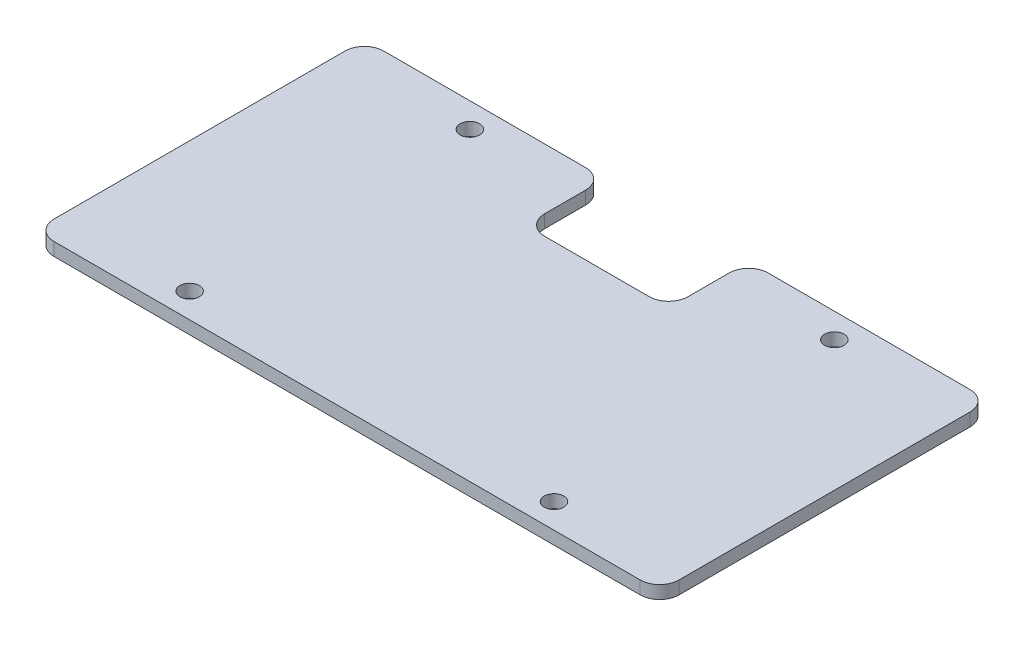
ISO-10303-21;
HEADER;
FILE_DESCRIPTION(('STEP AP214'),'2;1');
FILE_NAME('part.step','',(''),(''),'','','');
FILE_SCHEMA(('AUTOMOTIVE_DESIGN { 1 0 10303 214 1 1 1 1 }'));
ENDSEC;
DATA;
#1=APPLICATION_CONTEXT('core data for automotive mechanical design processes');
#2=APPLICATION_PROTOCOL_DEFINITION('international standard','automotive_design',2000,#1);
#3=PRODUCT_CONTEXT('',#1,'mechanical');
#4=PRODUCT('Part','Part','',(#3));
#5=PRODUCT_RELATED_PRODUCT_CATEGORY('part','',(#4));
#6=PRODUCT_DEFINITION_FORMATION('','',#4);
#7=PRODUCT_DEFINITION_CONTEXT('part definition',#1,'design');
#8=PRODUCT_DEFINITION('design','',#6,#7);
#9=PRODUCT_DEFINITION_SHAPE('','',#8);
#10=(LENGTH_UNIT() NAMED_UNIT(*) SI_UNIT(.MILLI.,.METRE.));
#11=(NAMED_UNIT(*) PLANE_ANGLE_UNIT() SI_UNIT($,.RADIAN.));
#12=(NAMED_UNIT(*) SI_UNIT($,.STERADIAN.) SOLID_ANGLE_UNIT());
#13=UNCERTAINTY_MEASURE_WITH_UNIT(LENGTH_MEASURE(1.E-05),#10,'distance_accuracy_value','');
#14=(GEOMETRIC_REPRESENTATION_CONTEXT(3) GLOBAL_UNCERTAINTY_ASSIGNED_CONTEXT((#13)) GLOBAL_UNIT_ASSIGNED_CONTEXT((#10,
#11,#12)) REPRESENTATION_CONTEXT('',''));
#15=CARTESIAN_POINT('',(0.,0.,0.));
#16=DIRECTION('',(0.,0.,1.));
#17=DIRECTION('',(1.,0.,0.));
#18=AXIS2_PLACEMENT_3D('',#15,#16,#17);
#19=CARTESIAN_POINT('',(0.,2.,0.));
#20=DIRECTION('',(0.,1.,0.));
#21=DIRECTION('',(0.,0.,1.));
#22=AXIS2_PLACEMENT_3D('',#19,#20,#21);
#23=PLANE('',#22);
#24=CARTESIAN_POINT('',(76.193894467691,2.,-46.99));
#25=DIRECTION('',(0.,-1.,0.));
#26=DIRECTION('',(0.,0.,-1.));
#27=AXIS2_PLACEMENT_3D('',#24,#25,#26);
#28=CIRCLE('',#27,1.5);
#29=CARTESIAN_POINT('',(76.193894467691,2.,-48.49));
#30=VERTEX_POINT('',#29);
#31=EDGE_CURVE('E724',#30,#30,#28,.T.);
#32=ORIENTED_EDGE('',*,*,#31,.T.);
#33=EDGE_LOOP('',(#32));
#34=FACE_BOUND('',#33,.T.);
#35=CARTESIAN_POINT('',(20.0638949415345,2.,-46.9827066008931));
#36=DIRECTION('',(0.,1.,0.));
#37=DIRECTION('',(0.,0.,1.));
#38=AXIS2_PLACEMENT_3D('',#35,#36,#37);
#39=CIRCLE('',#38,1.5);
#40=CARTESIAN_POINT('',(20.0638949415345,2.,-45.4827066008931));
#41=VERTEX_POINT('',#40);
#42=EDGE_CURVE('E443',#41,#41,#39,.T.);
#43=ORIENTED_EDGE('',*,*,#42,.F.);
#44=EDGE_LOOP('',(#43));
#45=FACE_BOUND('',#44,.T.);
#46=CARTESIAN_POINT('',(20.0638949415345,2.,-3.81729339910684));
#47=DIRECTION('',(0.,1.,0.));
#48=DIRECTION('',(0.,0.,1.));
#49=AXIS2_PLACEMENT_3D('',#46,#47,#48);
#50=CIRCLE('',#49,1.5);
#51=CARTESIAN_POINT('',(20.0638949415345,2.,-2.31729339910684));
#52=VERTEX_POINT('',#51);
#53=EDGE_CURVE('E431',#52,#52,#50,.F.);
#54=ORIENTED_EDGE('',*,*,#53,.T.);
#55=EDGE_LOOP('',(#54));
#56=FACE_BOUND('',#55,.T.);
#57=DIRECTION('',(0.,0.,1.));
#58=VECTOR('',#57,1.);
#59=CARTESIAN_POINT('',(0.,2.,-50.8));
#60=LINE('',#59,#58);
#61=CARTESIAN_POINT('',(0.,2.,-47.8));
#62=VERTEX_POINT('',#61);
#63=CARTESIAN_POINT('',(0.,2.,-3.));
#64=VERTEX_POINT('',#63);
#65=EDGE_CURVE('E452',#62,#64,#60,.T.);
#66=ORIENTED_EDGE('',*,*,#65,.T.);
#67=CARTESIAN_POINT('',(3.,2.,-3.));
#68=DIRECTION('',(0.,1.,0.));
#69=DIRECTION('',(0.,0.,1.));
#70=AXIS2_PLACEMENT_3D('',#67,#68,#69);
#71=CIRCLE('',#70,3.);
#72=CARTESIAN_POINT('',(3.,2.,0.));
#73=VERTEX_POINT('',#72);
#74=EDGE_CURVE('E360',#64,#73,#71,.T.);
#75=ORIENTED_EDGE('',*,*,#74,.T.);
#76=DIRECTION('',(1.,0.,0.));
#77=VECTOR('',#76,1.);
#78=CARTESIAN_POINT('',(0.,2.,0.));
#79=LINE('',#78,#77);
#80=CARTESIAN_POINT('',(93.27,2.,0.));
#81=VERTEX_POINT('',#80);
#82=EDGE_CURVE('E288',#73,#81,#79,.T.);
#83=ORIENTED_EDGE('',*,*,#82,.T.);
#84=CARTESIAN_POINT('',(93.27,2.,-3.));
#85=DIRECTION('',(0.,1.,0.));
#86=DIRECTION('',(0.,0.,1.));
#87=AXIS2_PLACEMENT_3D('',#84,#85,#86);
#88=CIRCLE('',#87,3.);
#89=CARTESIAN_POINT('',(96.27,2.,-3.));
#90=VERTEX_POINT('',#89);
#91=EDGE_CURVE('E357',#81,#90,#88,.T.);
#92=ORIENTED_EDGE('',*,*,#91,.T.);
#93=DIRECTION('',(0.,0.,-1.));
#94=VECTOR('',#93,1.);
#95=CARTESIAN_POINT('',(96.27,2.,0.));
#96=LINE('',#95,#94);
#97=CARTESIAN_POINT('',(96.27,2.,-47.8));
#98=VERTEX_POINT('',#97);
#99=EDGE_CURVE('E458',#90,#98,#96,.T.);
#100=ORIENTED_EDGE('',*,*,#99,.T.);
#101=CARTESIAN_POINT('',(93.27,2.,-47.8));
#102=DIRECTION('',(0.,1.,0.));
#103=DIRECTION('',(0.,0.,1.));
#104=AXIS2_PLACEMENT_3D('',#101,#102,#103);
#105=CIRCLE('',#104,3.);
#106=CARTESIAN_POINT('',(93.27,2.,-50.8));
#107=VERTEX_POINT('',#106);
#108=EDGE_CURVE('E354',#98,#107,#105,.T.);
#109=ORIENTED_EDGE('',*,*,#108,.T.);
#110=DIRECTION('',(-1.,0.,0.));
#111=VECTOR('',#110,1.);
#112=CARTESIAN_POINT('',(96.27,2.,-50.8));
#113=LINE('',#112,#111);
#114=CARTESIAN_POINT('',(62.18,2.,-50.8));
#115=VERTEX_POINT('',#114);
#116=EDGE_CURVE('E462',#107,#115,#113,.T.);
#117=ORIENTED_EDGE('',*,*,#116,.T.);
#118=CARTESIAN_POINT('',(62.18,2.,-47.8));
#119=DIRECTION('',(0.,1.,0.));
#120=DIRECTION('',(0.,0.,1.));
#121=AXIS2_PLACEMENT_3D('',#118,#119,#120);
#122=CIRCLE('',#121,3.);
#123=CARTESIAN_POINT('',(59.18,2.,-47.8));
#124=VERTEX_POINT('',#123);
#125=EDGE_CURVE('E348',#115,#124,#122,.T.);
#126=ORIENTED_EDGE('',*,*,#125,.T.);
#127=DIRECTION('',(0.,0.,1.));
#128=VECTOR('',#127,1.);
#129=CARTESIAN_POINT('',(59.18,2.,-50.8));
#130=LINE('',#129,#128);
#131=CARTESIAN_POINT('',(59.18,2.,-41.48));
#132=VERTEX_POINT('',#131);
#133=EDGE_CURVE('E426',#124,#132,#130,.T.);
#134=ORIENTED_EDGE('',*,*,#133,.T.);
#135=CARTESIAN_POINT('',(56.18,2.,-41.48));
#136=DIRECTION('',(0.,1.,0.));
#137=DIRECTION('',(0.,0.,1.));
#138=AXIS2_PLACEMENT_3D('',#135,#136,#137);
#139=CIRCLE('',#138,3.);
#140=CARTESIAN_POINT('',(56.18,2.,-38.48));
#141=VERTEX_POINT('',#140);
#142=EDGE_CURVE('E407',#132,#141,#139,.F.);
#143=ORIENTED_EDGE('',*,*,#142,.T.);
#144=DIRECTION('',(-1.,0.,0.));
#145=VECTOR('',#144,1.);
#146=CARTESIAN_POINT('',(59.18,2.,-38.48));
#147=LINE('',#146,#145);
#148=CARTESIAN_POINT('',(40.08,2.,-38.48));
#149=VERTEX_POINT('',#148);
#150=EDGE_CURVE('E423',#141,#149,#147,.T.);
#151=ORIENTED_EDGE('',*,*,#150,.T.);
#152=CARTESIAN_POINT('',(40.08,2.,-41.48));
#153=DIRECTION('',(0.,1.,0.));
#154=DIRECTION('',(0.,0.,1.));
#155=AXIS2_PLACEMENT_3D('',#152,#153,#154);
#156=CIRCLE('',#155,3.);
#157=CARTESIAN_POINT('',(37.08,2.,-41.48));
#158=VERTEX_POINT('',#157);
#159=EDGE_CURVE('E12',#149,#158,#156,.F.);
#160=ORIENTED_EDGE('',*,*,#159,.T.);
#161=DIRECTION('',(0.,0.,-1.));
#162=VECTOR('',#161,1.);
#163=CARTESIAN_POINT('',(37.08,2.,-38.48));
#164=LINE('',#163,#162);
#165=CARTESIAN_POINT('',(37.08,2.,-47.8));
#166=VERTEX_POINT('',#165);
#167=EDGE_CURVE('E325',#158,#166,#164,.T.);
#168=ORIENTED_EDGE('',*,*,#167,.T.);
#169=CARTESIAN_POINT('',(34.08,2.,-47.8));
#170=DIRECTION('',(0.,1.,0.));
#171=DIRECTION('',(0.,0.,1.));
#172=AXIS2_PLACEMENT_3D('',#169,#170,#171);
#173=CIRCLE('',#172,3.);
#174=CARTESIAN_POINT('',(34.08,2.,-50.8));
#175=VERTEX_POINT('',#174);
#176=EDGE_CURVE('E345',#166,#175,#173,.T.);
#177=ORIENTED_EDGE('',*,*,#176,.T.);
#178=DIRECTION('',(-1.,0.,0.));
#179=VECTOR('',#178,1.);
#180=CARTESIAN_POINT('',(37.08,2.,-50.8));
#181=LINE('',#180,#179);
#182=CARTESIAN_POINT('',(3.,2.,-50.8));
#183=VERTEX_POINT('',#182);
#184=EDGE_CURVE('E323',#175,#183,#181,.T.);
#185=ORIENTED_EDGE('',*,*,#184,.T.);
#186=CARTESIAN_POINT('',(3.,2.,-47.8));
#187=DIRECTION('',(0.,1.,0.));
#188=DIRECTION('',(0.,0.,1.));
#189=AXIS2_PLACEMENT_3D('',#186,#187,#188);
#190=CIRCLE('',#189,3.);
#191=EDGE_CURVE('E351',#183,#62,#190,.T.);
#192=ORIENTED_EDGE('',*,*,#191,.T.);
#193=EDGE_LOOP('',(#66,#75,#83,#92,#100,#109,#117,#126,#134,#143,#151,#160,#168,#177,#185,#192));
#194=FACE_BOUND('',#193,.T.);
#195=CARTESIAN_POINT('',(76.193894467691,2.,-3.80999999999998));
#196=DIRECTION('',(0.,1.,0.));
#197=DIRECTION('',(0.,0.,1.));
#198=AXIS2_PLACEMENT_3D('',#195,#196,#197);
#199=CIRCLE('',#198,1.5);
#200=CARTESIAN_POINT('',(76.193894467691,2.,-2.30999999999999));
#201=VERTEX_POINT('',#200);
#202=EDGE_CURVE('E715',#201,#201,#199,.T.);
#203=ORIENTED_EDGE('',*,*,#202,.F.);
#204=EDGE_LOOP('',(#203));
#205=FACE_BOUND('',#204,.T.);
#206=ADVANCED_FACE('F153',(#34,#45,#56,#194,#205),#23,.T.);
#207=CARTESIAN_POINT('',(0.,0.,0.));
#208=DIRECTION('',(0.,1.,0.));
#209=DIRECTION('',(0.,0.,1.));
#210=AXIS2_PLACEMENT_3D('',#207,#208,#209);
#211=PLANE('',#210);
#212=CARTESIAN_POINT('',(76.193894467691,0.,-46.99));
#213=DIRECTION('',(0.,-1.,0.));
#214=DIRECTION('',(0.,0.,-1.));
#215=AXIS2_PLACEMENT_3D('',#212,#213,#214);
#216=CIRCLE('',#215,1.5);
#217=CARTESIAN_POINT('',(76.193894467691,0.,-48.49));
#218=VERTEX_POINT('',#217);
#219=EDGE_CURVE('E727',#218,#218,#216,.T.);
#220=ORIENTED_EDGE('',*,*,#219,.F.);
#221=EDGE_LOOP('',(#220));
#222=FACE_BOUND('',#221,.T.);
#223=CARTESIAN_POINT('',(20.0638949415345,0.,-3.81729339910684));
#224=DIRECTION('',(0.,1.,0.));
#225=DIRECTION('',(0.,0.,1.));
#226=AXIS2_PLACEMENT_3D('',#223,#224,#225);
#227=CIRCLE('',#226,1.5);
#228=CARTESIAN_POINT('',(20.0638949415345,0.,-2.31729339910684));
#229=VERTEX_POINT('',#228);
#230=EDGE_CURVE('E437',#229,#229,#227,.F.);
#231=ORIENTED_EDGE('',*,*,#230,.F.);
#232=EDGE_LOOP('',(#231));
#233=FACE_BOUND('',#232,.T.);
#234=DIRECTION('',(1.,0.,0.));
#235=VECTOR('',#234,1.);
#236=CARTESIAN_POINT('',(0.,0.,0.));
#237=LINE('',#236,#235);
#238=CARTESIAN_POINT('',(3.,0.,0.));
#239=VERTEX_POINT('',#238);
#240=CARTESIAN_POINT('',(93.27,0.,0.));
#241=VERTEX_POINT('',#240);
#242=EDGE_CURVE('E285',#239,#241,#237,.T.);
#243=ORIENTED_EDGE('',*,*,#242,.F.);
#244=CARTESIAN_POINT('',(3.,0.,-3.));
#245=DIRECTION('',(0.,1.,0.));
#246=DIRECTION('',(0.,0.,1.));
#247=AXIS2_PLACEMENT_3D('',#244,#245,#246);
#248=CIRCLE('',#247,3.);
#249=CARTESIAN_POINT('',(0.,0.,-3.));
#250=VERTEX_POINT('',#249);
#251=EDGE_CURVE('E267',#239,#250,#248,.F.);
#252=ORIENTED_EDGE('',*,*,#251,.T.);
#253=DIRECTION('',(0.,0.,1.));
#254=VECTOR('',#253,1.);
#255=CARTESIAN_POINT('',(0.,0.,-50.8));
#256=LINE('',#255,#254);
#257=CARTESIAN_POINT('',(0.,0.,-47.8));
#258=VERTEX_POINT('',#257);
#259=EDGE_CURVE('E298',#258,#250,#256,.T.);
#260=ORIENTED_EDGE('',*,*,#259,.F.);
#261=CARTESIAN_POINT('',(3.,0.,-47.8));
#262=DIRECTION('',(0.,1.,0.));
#263=DIRECTION('',(0.,0.,1.));
#264=AXIS2_PLACEMENT_3D('',#261,#262,#263);
#265=CIRCLE('',#264,3.);
#266=CARTESIAN_POINT('',(3.,0.,-50.8));
#267=VERTEX_POINT('',#266);
#268=EDGE_CURVE('E332',#258,#267,#265,.F.);
#269=ORIENTED_EDGE('',*,*,#268,.T.);
#270=DIRECTION('',(-1.,0.,0.));
#271=VECTOR('',#270,1.);
#272=CARTESIAN_POINT('',(37.08,0.,-50.8));
#273=LINE('',#272,#271);
#274=CARTESIAN_POINT('',(34.08,0.,-50.8));
#275=VERTEX_POINT('',#274);
#276=EDGE_CURVE('E305',#275,#267,#273,.T.);
#277=ORIENTED_EDGE('',*,*,#276,.F.);
#278=CARTESIAN_POINT('',(34.08,0.,-47.8));
#279=DIRECTION('',(0.,1.,0.));
#280=DIRECTION('',(0.,0.,1.));
#281=AXIS2_PLACEMENT_3D('',#278,#279,#280);
#282=CIRCLE('',#281,3.);
#283=CARTESIAN_POINT('',(37.08,0.,-47.8));
#284=VERTEX_POINT('',#283);
#285=EDGE_CURVE('E290',#275,#284,#282,.F.);
#286=ORIENTED_EDGE('',*,*,#285,.T.);
#287=DIRECTION('',(0.,0.,-1.));
#288=VECTOR('',#287,1.);
#289=CARTESIAN_POINT('',(37.08,0.,-38.48));
#290=LINE('',#289,#288);
#291=CARTESIAN_POINT('',(37.08,0.,-41.48));
#292=VERTEX_POINT('',#291);
#293=EDGE_CURVE('E320',#292,#284,#290,.T.);
#294=ORIENTED_EDGE('',*,*,#293,.F.);
#295=CARTESIAN_POINT('',(40.08,0.,-41.48));
#296=DIRECTION('',(0.,1.,0.));
#297=DIRECTION('',(0.,0.,1.));
#298=AXIS2_PLACEMENT_3D('',#295,#296,#297);
#299=CIRCLE('',#298,3.);
#300=CARTESIAN_POINT('',(40.08,0.,-38.48));
#301=VERTEX_POINT('',#300);
#302=EDGE_CURVE('E162',#292,#301,#299,.T.);
#303=ORIENTED_EDGE('',*,*,#302,.T.);
#304=DIRECTION('',(-1.,0.,0.));
#305=VECTOR('',#304,1.);
#306=CARTESIAN_POINT('',(59.18,0.,-38.48));
#307=LINE('',#306,#305);
#308=CARTESIAN_POINT('',(56.18,0.,-38.48));
#309=VERTEX_POINT('',#308);
#310=EDGE_CURVE('E316',#309,#301,#307,.T.);
#311=ORIENTED_EDGE('',*,*,#310,.F.);
#312=CARTESIAN_POINT('',(56.18,0.,-41.48));
#313=DIRECTION('',(0.,1.,0.));
#314=DIRECTION('',(0.,0.,1.));
#315=AXIS2_PLACEMENT_3D('',#312,#313,#314);
#316=CIRCLE('',#315,3.);
#317=CARTESIAN_POINT('',(59.18,0.,-41.48));
#318=VERTEX_POINT('',#317);
#319=EDGE_CURVE('E404',#309,#318,#316,.T.);
#320=ORIENTED_EDGE('',*,*,#319,.T.);
#321=DIRECTION('',(0.,0.,1.));
#322=VECTOR('',#321,1.);
#323=CARTESIAN_POINT('',(59.18,0.,-50.8));
#324=LINE('',#323,#322);
#325=CARTESIAN_POINT('',(59.18,0.,-47.8));
#326=VERTEX_POINT('',#325);
#327=EDGE_CURVE('E312',#326,#318,#324,.T.);
#328=ORIENTED_EDGE('',*,*,#327,.F.);
#329=CARTESIAN_POINT('',(62.18,0.,-47.8));
#330=DIRECTION('',(0.,1.,0.));
#331=DIRECTION('',(0.,0.,1.));
#332=AXIS2_PLACEMENT_3D('',#329,#330,#331);
#333=CIRCLE('',#332,3.);
#334=CARTESIAN_POINT('',(62.18,0.,-50.8));
#335=VERTEX_POINT('',#334);
#336=EDGE_CURVE('E329',#326,#335,#333,.F.);
#337=ORIENTED_EDGE('',*,*,#336,.T.);
#338=DIRECTION('',(-1.,0.,0.));
#339=VECTOR('',#338,1.);
#340=CARTESIAN_POINT('',(96.27,0.,-50.8));
#341=LINE('',#340,#339);
#342=CARTESIAN_POINT('',(93.27,0.,-50.8));
#343=VERTEX_POINT('',#342);
#344=EDGE_CURVE('E303',#343,#335,#341,.T.);
#345=ORIENTED_EDGE('',*,*,#344,.F.);
#346=CARTESIAN_POINT('',(93.27,0.,-47.8));
#347=DIRECTION('',(0.,1.,0.));
#348=DIRECTION('',(0.,0.,1.));
#349=AXIS2_PLACEMENT_3D('',#346,#347,#348);
#350=CIRCLE('',#349,3.);
#351=CARTESIAN_POINT('',(96.27,0.,-47.8));
#352=VERTEX_POINT('',#351);
#353=EDGE_CURVE('E335',#343,#352,#350,.F.);
#354=ORIENTED_EDGE('',*,*,#353,.T.);
#355=DIRECTION('',(0.,0.,-1.));
#356=VECTOR('',#355,1.);
#357=CARTESIAN_POINT('',(96.27,0.,0.));
#358=LINE('',#357,#356);
#359=CARTESIAN_POINT('',(96.27,0.,-3.));
#360=VERTEX_POINT('',#359);
#361=EDGE_CURVE('E297',#360,#352,#358,.T.);
#362=ORIENTED_EDGE('',*,*,#361,.F.);
#363=CARTESIAN_POINT('',(93.27,0.,-3.));
#364=DIRECTION('',(0.,1.,0.));
#365=DIRECTION('',(0.,0.,1.));
#366=AXIS2_PLACEMENT_3D('',#363,#364,#365);
#367=CIRCLE('',#366,3.);
#368=EDGE_CURVE('E279',#360,#241,#367,.F.);
#369=ORIENTED_EDGE('',*,*,#368,.T.);
#370=EDGE_LOOP('',(#243,#252,#260,#269,#277,#286,#294,#303,#311,#320,#328,#337,#345,#354,#362,#369));
#371=FACE_BOUND('',#370,.T.);
#372=CARTESIAN_POINT('',(20.0638949415345,0.,-46.9827066008931));
#373=DIRECTION('',(0.,1.,0.));
#374=DIRECTION('',(0.,0.,1.));
#375=AXIS2_PLACEMENT_3D('',#372,#373,#374);
#376=CIRCLE('',#375,1.5);
#377=CARTESIAN_POINT('',(20.0638949415345,0.,-45.4827066008931));
#378=VERTEX_POINT('',#377);
#379=EDGE_CURVE('E446',#378,#378,#376,.T.);
#380=ORIENTED_EDGE('',*,*,#379,.T.);
#381=EDGE_LOOP('',(#380));
#382=FACE_BOUND('',#381,.T.);
#383=CARTESIAN_POINT('',(76.193894467691,0.,-3.80999999999998));
#384=DIRECTION('',(0.,1.,0.));
#385=DIRECTION('',(0.,0.,1.));
#386=AXIS2_PLACEMENT_3D('',#383,#384,#385);
#387=CIRCLE('',#386,1.5);
#388=CARTESIAN_POINT('',(76.193894467691,0.,-2.30999999999999));
#389=VERTEX_POINT('',#388);
#390=EDGE_CURVE('E719',#389,#389,#387,.T.);
#391=ORIENTED_EDGE('',*,*,#390,.T.);
#392=EDGE_LOOP('',(#391));
#393=FACE_BOUND('',#392,.T.);
#394=ADVANCED_FACE('F293',(#222,#233,#371,#382,#393),#211,.F.);
#395=CARTESIAN_POINT('',(37.08,2.,-50.8));
#396=DIRECTION('',(0.,0.,1.));
#397=DIRECTION('',(1.,0.,0.));
#398=AXIS2_PLACEMENT_3D('',#395,#396,#397);
#399=PLANE('',#398);
#400=ORIENTED_EDGE('',*,*,#276,.T.);
#401=DIRECTION('',(0.,-1.,0.));
#402=VECTOR('',#401,1.);
#403=CARTESIAN_POINT('',(3.,2.,-50.8));
#404=LINE('',#403,#402);
#405=EDGE_CURVE('E381',#267,#183,#404,.F.);
#406=ORIENTED_EDGE('',*,*,#405,.T.);
#407=ORIENTED_EDGE('',*,*,#184,.F.);
#408=DIRECTION('',(0.,-1.,0.));
#409=VECTOR('',#408,1.);
#410=CARTESIAN_POINT('',(34.08,2.,-50.8));
#411=LINE('',#410,#409);
#412=EDGE_CURVE('E377',#175,#275,#411,.T.);
#413=ORIENTED_EDGE('',*,*,#412,.T.);
#414=EDGE_LOOP('',(#400,#406,#407,#413));
#415=FACE_BOUND('',#414,.T.);
#416=ADVANCED_FACE('F507',(#415),#399,.F.);
#417=CARTESIAN_POINT('',(0.,2.,-50.8));
#418=DIRECTION('',(1.,0.,0.));
#419=DIRECTION('',(0.,0.,-1.));
#420=AXIS2_PLACEMENT_3D('',#417,#418,#419);
#421=PLANE('',#420);
#422=ORIENTED_EDGE('',*,*,#259,.T.);
#423=DIRECTION('',(0.,-1.,0.));
#424=VECTOR('',#423,1.);
#425=CARTESIAN_POINT('',(0.,2.,-3.));
#426=LINE('',#425,#424);
#427=EDGE_CURVE('E272',#250,#64,#426,.F.);
#428=ORIENTED_EDGE('',*,*,#427,.T.);
#429=ORIENTED_EDGE('',*,*,#65,.F.);
#430=DIRECTION('',(0.,-1.,0.));
#431=VECTOR('',#430,1.);
#432=CARTESIAN_POINT('',(0.,2.,-47.8));
#433=LINE('',#432,#431);
#434=EDGE_CURVE('E278',#62,#258,#433,.T.);
#435=ORIENTED_EDGE('',*,*,#434,.T.);
#436=EDGE_LOOP('',(#422,#428,#429,#435));
#437=FACE_BOUND('',#436,.T.);
#438=ADVANCED_FACE('F501',(#437),#421,.F.);
#439=CARTESIAN_POINT('',(0.,2.,0.));
#440=DIRECTION('',(0.,0.,-1.));
#441=DIRECTION('',(-1.,0.,0.));
#442=AXIS2_PLACEMENT_3D('',#439,#440,#441);
#443=PLANE('',#442);
#444=ORIENTED_EDGE('',*,*,#82,.F.);
#445=DIRECTION('',(0.,-1.,0.));
#446=VECTOR('',#445,1.);
#447=CARTESIAN_POINT('',(3.,2.,0.));
#448=LINE('',#447,#446);
#449=EDGE_CURVE('E271',#73,#239,#448,.T.);
#450=ORIENTED_EDGE('',*,*,#449,.T.);
#451=ORIENTED_EDGE('',*,*,#242,.T.);
#452=DIRECTION('',(0.,-1.,0.));
#453=VECTOR('',#452,1.);
#454=CARTESIAN_POINT('',(93.27,2.,0.));
#455=LINE('',#454,#453);
#456=EDGE_CURVE('E291',#241,#81,#455,.F.);
#457=ORIENTED_EDGE('',*,*,#456,.T.);
#458=EDGE_LOOP('',(#444,#450,#451,#457));
#459=FACE_BOUND('',#458,.T.);
#460=ADVANCED_FACE('F284',(#459),#443,.F.);
#461=CARTESIAN_POINT('',(96.27,2.,0.));
#462=DIRECTION('',(-1.,0.,0.));
#463=DIRECTION('',(0.,0.,1.));
#464=AXIS2_PLACEMENT_3D('',#461,#462,#463);
#465=PLANE('',#464);
#466=ORIENTED_EDGE('',*,*,#99,.F.);
#467=DIRECTION('',(0.,-1.,0.));
#468=VECTOR('',#467,1.);
#469=CARTESIAN_POINT('',(96.27,2.,-3.));
#470=LINE('',#469,#468);
#471=EDGE_CURVE('E366',#90,#360,#470,.T.);
#472=ORIENTED_EDGE('',*,*,#471,.T.);
#473=ORIENTED_EDGE('',*,*,#361,.T.);
#474=DIRECTION('',(0.,-1.,0.));
#475=VECTOR('',#474,1.);
#476=CARTESIAN_POINT('',(96.27,2.,-47.8));
#477=LINE('',#476,#475);
#478=EDGE_CURVE('E363',#352,#98,#477,.F.);
#479=ORIENTED_EDGE('',*,*,#478,.T.);
#480=EDGE_LOOP('',(#466,#472,#473,#479));
#481=FACE_BOUND('',#480,.T.);
#482=ADVANCED_FACE('F492',(#481),#465,.F.);
#483=CARTESIAN_POINT('',(96.27,2.,-50.8));
#484=DIRECTION('',(0.,0.,1.));
#485=DIRECTION('',(1.,0.,0.));
#486=AXIS2_PLACEMENT_3D('',#483,#484,#485);
#487=PLANE('',#486);
#488=ORIENTED_EDGE('',*,*,#116,.F.);
#489=DIRECTION('',(0.,-1.,0.));
#490=VECTOR('',#489,1.);
#491=CARTESIAN_POINT('',(93.27,2.,-50.8));
#492=LINE('',#491,#490);
#493=EDGE_CURVE('E373',#107,#343,#492,.T.);
#494=ORIENTED_EDGE('',*,*,#493,.T.);
#495=ORIENTED_EDGE('',*,*,#344,.T.);
#496=DIRECTION('',(0.,-1.,0.));
#497=VECTOR('',#496,1.);
#498=CARTESIAN_POINT('',(62.18,2.,-50.8));
#499=LINE('',#498,#497);
#500=EDGE_CURVE('E370',#335,#115,#499,.F.);
#501=ORIENTED_EDGE('',*,*,#500,.T.);
#502=EDGE_LOOP('',(#488,#494,#495,#501));
#503=FACE_BOUND('',#502,.T.);
#504=ADVANCED_FACE('F484',(#503),#487,.F.);
#505=CARTESIAN_POINT('',(59.18,2.,-50.8));
#506=DIRECTION('',(1.,0.,0.));
#507=DIRECTION('',(0.,0.,-1.));
#508=AXIS2_PLACEMENT_3D('',#505,#506,#507);
#509=PLANE('',#508);
#510=ORIENTED_EDGE('',*,*,#327,.T.);
#511=DIRECTION('',(0.,-1.,0.));
#512=VECTOR('',#511,1.);
#513=CARTESIAN_POINT('',(59.18,2.,-41.48));
#514=LINE('',#513,#512);
#515=EDGE_CURVE('E395',#318,#132,#514,.F.);
#516=ORIENTED_EDGE('',*,*,#515,.T.);
#517=ORIENTED_EDGE('',*,*,#133,.F.);
#518=DIRECTION('',(0.,-1.,0.));
#519=VECTOR('',#518,1.);
#520=CARTESIAN_POINT('',(59.18,2.,-47.8));
#521=LINE('',#520,#519);
#522=EDGE_CURVE('E391',#124,#326,#521,.T.);
#523=ORIENTED_EDGE('',*,*,#522,.T.);
#524=EDGE_LOOP('',(#510,#516,#517,#523));
#525=FACE_BOUND('',#524,.T.);
#526=ADVANCED_FACE('F477',(#525),#509,.F.);
#527=CARTESIAN_POINT('',(59.18,2.,-38.48));
#528=DIRECTION('',(0.,0.,1.));
#529=DIRECTION('',(1.,0.,0.));
#530=AXIS2_PLACEMENT_3D('',#527,#528,#529);
#531=PLANE('',#530);
#532=ORIENTED_EDGE('',*,*,#150,.F.);
#533=DIRECTION('',(0.,-1.,0.));
#534=VECTOR('',#533,1.);
#535=CARTESIAN_POINT('',(56.18,0.,-38.48));
#536=LINE('',#535,#534);
#537=EDGE_CURVE('E387',#141,#309,#536,.T.);
#538=ORIENTED_EDGE('',*,*,#537,.T.);
#539=ORIENTED_EDGE('',*,*,#310,.T.);
#540=DIRECTION('',(0.,-1.,0.));
#541=VECTOR('',#540,1.);
#542=CARTESIAN_POINT('',(40.08,2.,-38.48));
#543=LINE('',#542,#541);
#544=EDGE_CURVE('E384',#301,#149,#543,.F.);
#545=ORIENTED_EDGE('',*,*,#544,.T.);
#546=EDGE_LOOP('',(#532,#538,#539,#545));
#547=FACE_BOUND('',#546,.T.);
#548=ADVANCED_FACE('F417',(#547),#531,.F.);
#549=CARTESIAN_POINT('',(37.08,2.,-38.48));
#550=DIRECTION('',(-1.,0.,0.));
#551=DIRECTION('',(0.,0.,1.));
#552=AXIS2_PLACEMENT_3D('',#549,#550,#551);
#553=PLANE('',#552);
#554=ORIENTED_EDGE('',*,*,#167,.F.);
#555=DIRECTION('',(0.,-1.,0.));
#556=VECTOR('',#555,1.);
#557=CARTESIAN_POINT('',(37.08,0.,-41.48));
#558=LINE('',#557,#556);
#559=EDGE_CURVE('E400',#158,#292,#558,.T.);
#560=ORIENTED_EDGE('',*,*,#559,.T.);
#561=ORIENTED_EDGE('',*,*,#293,.T.);
#562=DIRECTION('',(0.,-1.,0.));
#563=VECTOR('',#562,1.);
#564=CARTESIAN_POINT('',(37.08,2.,-47.8));
#565=LINE('',#564,#563);
#566=EDGE_CURVE('E169',#284,#166,#565,.F.);
#567=ORIENTED_EDGE('',*,*,#566,.T.);
#568=EDGE_LOOP('',(#554,#560,#561,#567));
#569=FACE_BOUND('',#568,.T.);
#570=ADVANCED_FACE('F420',(#569),#553,.F.);
#571=CARTESIAN_POINT('',(20.0638949415345,2.,-3.81729339910684));
#572=DIRECTION('',(0.,-1.,0.));
#573=DIRECTION('',(0.,0.,-1.));
#574=AXIS2_PLACEMENT_3D('',#571,#572,#573);
#575=CYLINDRICAL_SURFACE('',#574,1.5);
#576=ORIENTED_EDGE('',*,*,#53,.F.);
#577=EDGE_LOOP('',(#576));
#578=FACE_BOUND('',#577,.T.);
#579=ORIENTED_EDGE('',*,*,#230,.T.);
#580=EDGE_LOOP('',(#579));
#581=FACE_BOUND('',#580,.T.);
#582=ADVANCED_FACE('F527',(#578,#581),#575,.F.);
#583=CARTESIAN_POINT('',(20.0638949415345,2.,-46.9827066008931));
#584=DIRECTION('',(0.,-1.,0.));
#585=DIRECTION('',(0.,0.,-1.));
#586=AXIS2_PLACEMENT_3D('',#583,#584,#585);
#587=CYLINDRICAL_SURFACE('',#586,1.5);
#588=ORIENTED_EDGE('',*,*,#42,.T.);
#589=EDGE_LOOP('',(#588));
#590=FACE_BOUND('',#589,.T.);
#591=ORIENTED_EDGE('',*,*,#379,.F.);
#592=EDGE_LOOP('',(#591));
#593=FACE_BOUND('',#592,.T.);
#594=ADVANCED_FACE('F649',(#590,#593),#587,.F.);
#595=CARTESIAN_POINT('',(76.193894467691,2.,-3.80999999999998));
#596=DIRECTION('',(0.,-1.,0.));
#597=DIRECTION('',(0.,0.,-1.));
#598=AXIS2_PLACEMENT_3D('',#595,#596,#597);
#599=CYLINDRICAL_SURFACE('',#598,1.5);
#600=ORIENTED_EDGE('',*,*,#202,.T.);
#601=EDGE_LOOP('',(#600));
#602=FACE_BOUND('',#601,.T.);
#603=ORIENTED_EDGE('',*,*,#390,.F.);
#604=EDGE_LOOP('',(#603));
#605=FACE_BOUND('',#604,.T.);
#606=ADVANCED_FACE('F640',(#602,#605),#599,.F.);
#607=CARTESIAN_POINT('',(76.193894467691,2.,-46.99));
#608=DIRECTION('',(0.,-1.,0.));
#609=DIRECTION('',(0.,0.,-1.));
#610=AXIS2_PLACEMENT_3D('',#607,#608,#609);
#611=CYLINDRICAL_SURFACE('',#610,1.5);
#612=ORIENTED_EDGE('',*,*,#31,.F.);
#613=EDGE_LOOP('',(#612));
#614=FACE_BOUND('',#613,.T.);
#615=ORIENTED_EDGE('',*,*,#219,.T.);
#616=EDGE_LOOP('',(#615));
#617=FACE_BOUND('',#616,.T.);
#618=ADVANCED_FACE('F578',(#614,#617),#611,.F.);
#619=CARTESIAN_POINT('',(3.,2.,-3.));
#620=DIRECTION('',(0.,-1.,0.));
#621=DIRECTION('',(0.,0.,-1.));
#622=AXIS2_PLACEMENT_3D('',#619,#620,#621);
#623=CYLINDRICAL_SURFACE('',#622,3.);
#624=ORIENTED_EDGE('',*,*,#74,.F.);
#625=ORIENTED_EDGE('',*,*,#427,.F.);
#626=ORIENTED_EDGE('',*,*,#251,.F.);
#627=ORIENTED_EDGE('',*,*,#449,.F.);
#628=EDGE_LOOP('',(#624,#625,#626,#627));
#629=FACE_BOUND('',#628,.T.);
#630=ADVANCED_FACE('F270',(#629),#623,.T.);
#631=CARTESIAN_POINT('',(93.27,2.,-3.));
#632=DIRECTION('',(0.,-1.,0.));
#633=DIRECTION('',(0.,0.,-1.));
#634=AXIS2_PLACEMENT_3D('',#631,#632,#633);
#635=CYLINDRICAL_SURFACE('',#634,3.);
#636=ORIENTED_EDGE('',*,*,#91,.F.);
#637=ORIENTED_EDGE('',*,*,#456,.F.);
#638=ORIENTED_EDGE('',*,*,#368,.F.);
#639=ORIENTED_EDGE('',*,*,#471,.F.);
#640=EDGE_LOOP('',(#636,#637,#638,#639));
#641=FACE_BOUND('',#640,.T.);
#642=ADVANCED_FACE('F496',(#641),#635,.T.);
#643=CARTESIAN_POINT('',(93.27,2.,-47.8));
#644=DIRECTION('',(0.,-1.,0.));
#645=DIRECTION('',(0.,0.,-1.));
#646=AXIS2_PLACEMENT_3D('',#643,#644,#645);
#647=CYLINDRICAL_SURFACE('',#646,3.);
#648=ORIENTED_EDGE('',*,*,#108,.F.);
#649=ORIENTED_EDGE('',*,*,#478,.F.);
#650=ORIENTED_EDGE('',*,*,#353,.F.);
#651=ORIENTED_EDGE('',*,*,#493,.F.);
#652=EDGE_LOOP('',(#648,#649,#650,#651));
#653=FACE_BOUND('',#652,.T.);
#654=ADVANCED_FACE('F488',(#653),#647,.T.);
#655=CARTESIAN_POINT('',(3.,2.,-47.8));
#656=DIRECTION('',(0.,-1.,0.));
#657=DIRECTION('',(0.,0.,-1.));
#658=AXIS2_PLACEMENT_3D('',#655,#656,#657);
#659=CYLINDRICAL_SURFACE('',#658,3.);
#660=ORIENTED_EDGE('',*,*,#191,.F.);
#661=ORIENTED_EDGE('',*,*,#405,.F.);
#662=ORIENTED_EDGE('',*,*,#268,.F.);
#663=ORIENTED_EDGE('',*,*,#434,.F.);
#664=EDGE_LOOP('',(#660,#661,#662,#663));
#665=FACE_BOUND('',#664,.T.);
#666=ADVANCED_FACE('F503',(#665),#659,.T.);
#667=CARTESIAN_POINT('',(56.18,2.,-41.48));
#668=DIRECTION('',(0.,1.,0.));
#669=DIRECTION('',(0.,0.,1.));
#670=AXIS2_PLACEMENT_3D('',#667,#668,#669);
#671=CYLINDRICAL_SURFACE('',#670,3.);
#672=ORIENTED_EDGE('',*,*,#142,.F.);
#673=ORIENTED_EDGE('',*,*,#515,.F.);
#674=ORIENTED_EDGE('',*,*,#319,.F.);
#675=ORIENTED_EDGE('',*,*,#537,.F.);
#676=EDGE_LOOP('',(#672,#673,#674,#675));
#677=FACE_BOUND('',#676,.T.);
#678=ADVANCED_FACE('F475',(#677),#671,.F.);
#679=CARTESIAN_POINT('',(62.18,2.,-47.8));
#680=DIRECTION('',(0.,-1.,0.));
#681=DIRECTION('',(0.,0.,-1.));
#682=AXIS2_PLACEMENT_3D('',#679,#680,#681);
#683=CYLINDRICAL_SURFACE('',#682,3.);
#684=ORIENTED_EDGE('',*,*,#125,.F.);
#685=ORIENTED_EDGE('',*,*,#500,.F.);
#686=ORIENTED_EDGE('',*,*,#336,.F.);
#687=ORIENTED_EDGE('',*,*,#522,.F.);
#688=EDGE_LOOP('',(#684,#685,#686,#687));
#689=FACE_BOUND('',#688,.T.);
#690=ADVANCED_FACE('F479',(#689),#683,.T.);
#691=CARTESIAN_POINT('',(40.08,2.,-41.48));
#692=DIRECTION('',(0.,1.,0.));
#693=DIRECTION('',(0.,0.,1.));
#694=AXIS2_PLACEMENT_3D('',#691,#692,#693);
#695=CYLINDRICAL_SURFACE('',#694,3.);
#696=ORIENTED_EDGE('',*,*,#159,.F.);
#697=ORIENTED_EDGE('',*,*,#544,.F.);
#698=ORIENTED_EDGE('',*,*,#302,.F.);
#699=ORIENTED_EDGE('',*,*,#559,.F.);
#700=EDGE_LOOP('',(#696,#697,#698,#699));
#701=FACE_BOUND('',#700,.T.);
#702=ADVANCED_FACE('F419',(#701),#695,.F.);
#703=CARTESIAN_POINT('',(34.08,2.,-47.8));
#704=DIRECTION('',(0.,-1.,0.));
#705=DIRECTION('',(0.,0.,-1.));
#706=AXIS2_PLACEMENT_3D('',#703,#704,#705);
#707=CYLINDRICAL_SURFACE('',#706,3.);
#708=ORIENTED_EDGE('',*,*,#176,.F.);
#709=ORIENTED_EDGE('',*,*,#566,.F.);
#710=ORIENTED_EDGE('',*,*,#285,.F.);
#711=ORIENTED_EDGE('',*,*,#412,.F.);
#712=EDGE_LOOP('',(#708,#709,#710,#711));
#713=FACE_BOUND('',#712,.T.);
#714=ADVANCED_FACE('F155',(#713),#707,.T.);
#715=CLOSED_SHELL('',(#206,#394,#416,#438,#460,#482,#504,#526,#548,#570,#582,#594,#606,#618,
#630,#642,#654,#666,#678,#690,#702,#714));
#716=MANIFOLD_SOLID_BREP('B2',#715);
#717=ADVANCED_BREP_SHAPE_REPRESENTATION('',(#18,#716),#14);
#718=SHAPE_DEFINITION_REPRESENTATION(#9,#717);
ENDSEC;
END-ISO-10303-21;
